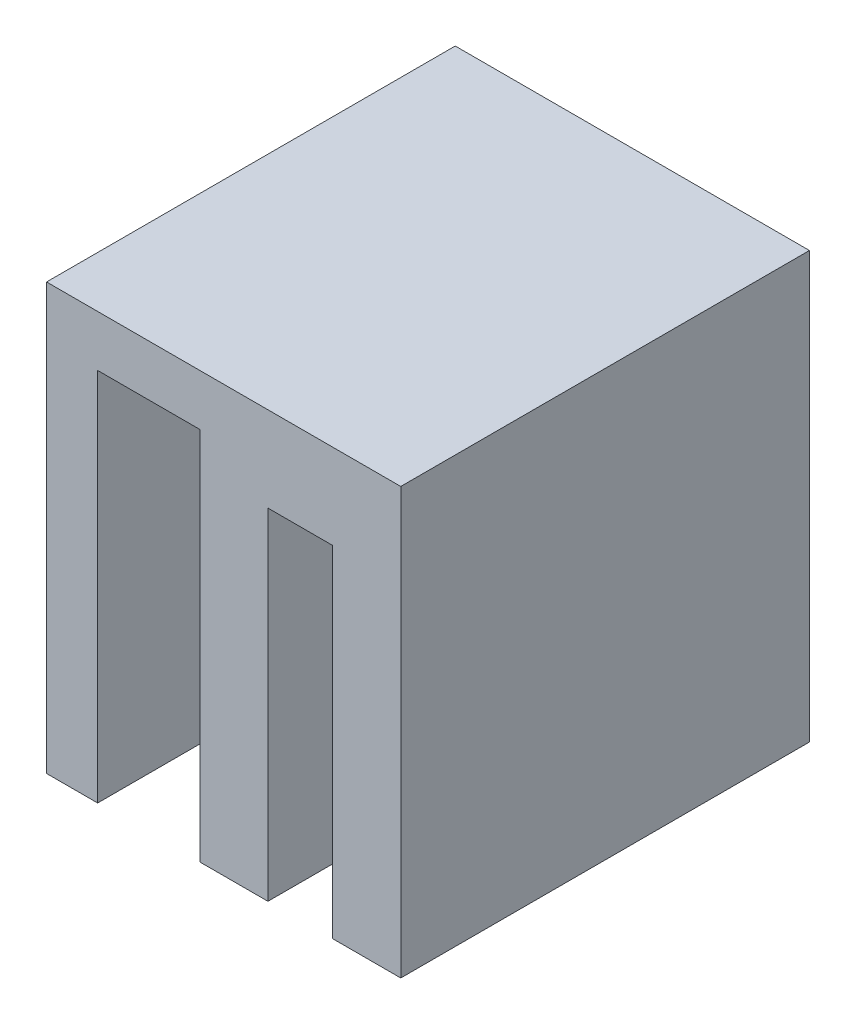
ISO-10303-21;
HEADER;
FILE_DESCRIPTION(('STEP AP214'),'2;1');
FILE_NAME('part.step','',(''),(''),'','','');
FILE_SCHEMA(('AUTOMOTIVE_DESIGN { 1 0 10303 214 1 1 1 1 }'));
ENDSEC;
DATA;
#1=APPLICATION_CONTEXT('core data for automotive mechanical design processes');
#2=APPLICATION_PROTOCOL_DEFINITION('international standard','automotive_design',2000,#1);
#3=PRODUCT_CONTEXT('',#1,'mechanical');
#4=PRODUCT('Part','Part','',(#3));
#5=PRODUCT_RELATED_PRODUCT_CATEGORY('part','',(#4));
#6=PRODUCT_DEFINITION_FORMATION('','',#4);
#7=PRODUCT_DEFINITION_CONTEXT('part definition',#1,'design');
#8=PRODUCT_DEFINITION('design','',#6,#7);
#9=PRODUCT_DEFINITION_SHAPE('','',#8);
#10=(LENGTH_UNIT() NAMED_UNIT(*) SI_UNIT(.MILLI.,.METRE.));
#11=(NAMED_UNIT(*) PLANE_ANGLE_UNIT() SI_UNIT($,.RADIAN.));
#12=(NAMED_UNIT(*) SI_UNIT($,.STERADIAN.) SOLID_ANGLE_UNIT());
#13=UNCERTAINTY_MEASURE_WITH_UNIT(LENGTH_MEASURE(1.E-05),#10,'distance_accuracy_value','');
#14=(GEOMETRIC_REPRESENTATION_CONTEXT(3) GLOBAL_UNCERTAINTY_ASSIGNED_CONTEXT((#13)) GLOBAL_UNIT_ASSIGNED_CONTEXT((#10,
#11,#12)) REPRESENTATION_CONTEXT('',''));
#15=CARTESIAN_POINT('',(0.,0.,0.));
#16=DIRECTION('',(0.,0.,1.));
#17=DIRECTION('',(1.,0.,0.));
#18=AXIS2_PLACEMENT_3D('',#15,#16,#17);
#19=CARTESIAN_POINT('',(-8.4,0.,12.));
#20=DIRECTION('',(1.,0.,0.));
#21=DIRECTION('',(0.,1.,0.));
#22=AXIS2_PLACEMENT_3D('',#19,#20,#21);
#23=PLANE('',#22);
#24=DIRECTION('',(0.,-1.,0.));
#25=VECTOR('',#24,1.);
#26=CARTESIAN_POINT('',(-8.4,0.,0.));
#27=LINE('',#26,#25);
#28=CARTESIAN_POINT('',(-8.4,2.5,0.));
#29=VERTEX_POINT('',#28);
#30=CARTESIAN_POINT('',(-8.4,-10.,0.));
#31=VERTEX_POINT('',#30);
#32=EDGE_CURVE('E153',#29,#31,#27,.T.);
#33=ORIENTED_EDGE('',*,*,#32,.T.);
#34=DIRECTION('',(0.,0.,-1.));
#35=VECTOR('',#34,1.);
#36=CARTESIAN_POINT('',(-8.4,-10.,12.));
#37=LINE('',#36,#35);
#38=CARTESIAN_POINT('',(-8.4,-10.,12.));
#39=VERTEX_POINT('',#38);
#40=EDGE_CURVE('E11',#39,#31,#37,.T.);
#41=ORIENTED_EDGE('',*,*,#40,.F.);
#42=DIRECTION('',(0.,-1.,0.));
#43=VECTOR('',#42,1.);
#44=CARTESIAN_POINT('',(-8.4,0.,12.));
#45=LINE('',#44,#43);
#46=CARTESIAN_POINT('',(-8.4,2.5,12.));
#47=VERTEX_POINT('',#46);
#48=EDGE_CURVE('E178',#47,#39,#45,.T.);
#49=ORIENTED_EDGE('',*,*,#48,.F.);
#50=DIRECTION('',(0.,0.,-1.));
#51=VECTOR('',#50,1.);
#52=CARTESIAN_POINT('',(-8.4,2.5,12.));
#53=LINE('',#52,#51);
#54=EDGE_CURVE('E149',#47,#29,#53,.T.);
#55=ORIENTED_EDGE('',*,*,#54,.T.);
#56=EDGE_LOOP('',(#33,#41,#49,#55));
#57=FACE_BOUND('',#56,.T.);
#58=ADVANCED_FACE('F33',(#57),#23,.F.);
#59=CARTESIAN_POINT('',(0.,-10.,12.));
#60=DIRECTION('',(0.,1.,0.));
#61=DIRECTION('',(0.,0.,1.));
#62=AXIS2_PLACEMENT_3D('',#59,#60,#61);
#63=PLANE('',#62);
#64=DIRECTION('',(1.,0.,0.));
#65=VECTOR('',#64,1.);
#66=CARTESIAN_POINT('',(0.,-10.,0.));
#67=LINE('',#66,#65);
#68=CARTESIAN_POINT('',(-6.9,-10.,0.));
#69=VERTEX_POINT('',#68);
#70=EDGE_CURVE('E156',#31,#69,#67,.T.);
#71=ORIENTED_EDGE('',*,*,#70,.T.);
#72=DIRECTION('',(0.,0.,-1.));
#73=VECTOR('',#72,1.);
#74=CARTESIAN_POINT('',(-6.9,-10.,12.));
#75=LINE('',#74,#73);
#76=CARTESIAN_POINT('',(-6.9,-10.,12.));
#77=VERTEX_POINT('',#76);
#78=EDGE_CURVE('E41',#77,#69,#75,.T.);
#79=ORIENTED_EDGE('',*,*,#78,.F.);
#80=DIRECTION('',(1.,0.,0.));
#81=VECTOR('',#80,1.);
#82=CARTESIAN_POINT('',(0.,-10.,12.));
#83=LINE('',#82,#81);
#84=EDGE_CURVE('E104',#39,#77,#83,.T.);
#85=ORIENTED_EDGE('',*,*,#84,.F.);
#86=ORIENTED_EDGE('',*,*,#40,.T.);
#87=EDGE_LOOP('',(#71,#79,#85,#86));
#88=FACE_BOUND('',#87,.T.);
#89=ADVANCED_FACE('F203',(#88),#63,.F.);
#90=CARTESIAN_POINT('',(-6.9,0.,12.));
#91=DIRECTION('',(1.,0.,0.));
#92=DIRECTION('',(0.,1.,0.));
#93=AXIS2_PLACEMENT_3D('',#90,#91,#92);
#94=PLANE('',#93);
#95=DIRECTION('',(0.,-1.,0.));
#96=VECTOR('',#95,1.);
#97=CARTESIAN_POINT('',(-6.9,0.,0.));
#98=LINE('',#97,#96);
#99=CARTESIAN_POINT('',(-6.9,0.999999999999999,0.));
#100=VERTEX_POINT('',#99);
#101=EDGE_CURVE('E159',#100,#69,#98,.T.);
#102=ORIENTED_EDGE('',*,*,#101,.F.);
#103=DIRECTION('',(0.,0.,-1.));
#104=VECTOR('',#103,1.);
#105=CARTESIAN_POINT('',(-6.9,0.999999999999999,12.));
#106=LINE('',#105,#104);
#107=CARTESIAN_POINT('',(-6.9,0.999999999999999,12.));
#108=VERTEX_POINT('',#107);
#109=EDGE_CURVE('E196',#108,#100,#106,.T.);
#110=ORIENTED_EDGE('',*,*,#109,.F.);
#111=DIRECTION('',(0.,-1.,0.));
#112=VECTOR('',#111,1.);
#113=CARTESIAN_POINT('',(-6.9,0.,12.));
#114=LINE('',#113,#112);
#115=EDGE_CURVE('E202',#108,#77,#114,.T.);
#116=ORIENTED_EDGE('',*,*,#115,.T.);
#117=ORIENTED_EDGE('',*,*,#78,.T.);
#118=EDGE_LOOP('',(#102,#110,#116,#117));
#119=FACE_BOUND('',#118,.T.);
#120=ADVANCED_FACE('F200',(#119),#94,.T.);
#121=CARTESIAN_POINT('',(0.,1.,12.));
#122=DIRECTION('',(0.,-1.,0.));
#123=DIRECTION('',(1.,0.,0.));
#124=AXIS2_PLACEMENT_3D('',#121,#122,#123);
#125=PLANE('',#124);
#126=DIRECTION('',(-1.,0.,0.));
#127=VECTOR('',#126,1.);
#128=CARTESIAN_POINT('',(0.,1.,0.));
#129=LINE('',#128,#127);
#130=CARTESIAN_POINT('',(-3.9,0.999999999999999,0.));
#131=VERTEX_POINT('',#130);
#132=EDGE_CURVE('E162',#131,#100,#129,.T.);
#133=ORIENTED_EDGE('',*,*,#132,.F.);
#134=DIRECTION('',(0.,0.,-1.));
#135=VECTOR('',#134,1.);
#136=CARTESIAN_POINT('',(-3.9,0.999999999999999,12.));
#137=LINE('',#136,#135);
#138=CARTESIAN_POINT('',(-3.9,0.999999999999999,12.));
#139=VERTEX_POINT('',#138);
#140=EDGE_CURVE('E194',#139,#131,#137,.T.);
#141=ORIENTED_EDGE('',*,*,#140,.F.);
#142=DIRECTION('',(-1.,0.,0.));
#143=VECTOR('',#142,1.);
#144=CARTESIAN_POINT('',(0.,1.,12.));
#145=LINE('',#144,#143);
#146=EDGE_CURVE('E216',#139,#108,#145,.T.);
#147=ORIENTED_EDGE('',*,*,#146,.T.);
#148=ORIENTED_EDGE('',*,*,#109,.T.);
#149=EDGE_LOOP('',(#133,#141,#147,#148));
#150=FACE_BOUND('',#149,.T.);
#151=ADVANCED_FACE('F212',(#150),#125,.T.);
#152=CARTESIAN_POINT('',(-3.9,0.,12.));
#153=DIRECTION('',(1.,0.,0.));
#154=DIRECTION('',(0.,1.,0.));
#155=AXIS2_PLACEMENT_3D('',#152,#153,#154);
#156=PLANE('',#155);
#157=DIRECTION('',(0.,-1.,0.));
#158=VECTOR('',#157,1.);
#159=CARTESIAN_POINT('',(-3.9,0.,0.));
#160=LINE('',#159,#158);
#161=CARTESIAN_POINT('',(-3.9,-10.,0.));
#162=VERTEX_POINT('',#161);
#163=EDGE_CURVE('E165',#131,#162,#160,.T.);
#164=ORIENTED_EDGE('',*,*,#163,.T.);
#165=DIRECTION('',(0.,0.,-1.));
#166=VECTOR('',#165,1.);
#167=CARTESIAN_POINT('',(-3.9,-10.,12.));
#168=LINE('',#167,#166);
#169=CARTESIAN_POINT('',(-3.9,-10.,12.));
#170=VERTEX_POINT('',#169);
#171=EDGE_CURVE('E191',#170,#162,#168,.T.);
#172=ORIENTED_EDGE('',*,*,#171,.F.);
#173=DIRECTION('',(0.,-1.,0.));
#174=VECTOR('',#173,1.);
#175=CARTESIAN_POINT('',(-3.9,0.,12.));
#176=LINE('',#175,#174);
#177=EDGE_CURVE('E218',#139,#170,#176,.T.);
#178=ORIENTED_EDGE('',*,*,#177,.F.);
#179=ORIENTED_EDGE('',*,*,#140,.T.);
#180=EDGE_LOOP('',(#164,#172,#178,#179));
#181=FACE_BOUND('',#180,.T.);
#182=ADVANCED_FACE('F262',(#181),#156,.F.);
#183=CARTESIAN_POINT('',(0.,-10.,12.));
#184=DIRECTION('',(0.,1.,0.));
#185=DIRECTION('',(0.,0.,1.));
#186=AXIS2_PLACEMENT_3D('',#183,#184,#185);
#187=PLANE('',#186);
#188=DIRECTION('',(1.,0.,0.));
#189=VECTOR('',#188,1.);
#190=CARTESIAN_POINT('',(0.,-10.,0.));
#191=LINE('',#190,#189);
#192=CARTESIAN_POINT('',(-1.9,-10.,0.));
#193=VERTEX_POINT('',#192);
#194=EDGE_CURVE('E167',#162,#193,#191,.T.);
#195=ORIENTED_EDGE('',*,*,#194,.T.);
#196=DIRECTION('',(0.,0.,-1.));
#197=VECTOR('',#196,1.);
#198=CARTESIAN_POINT('',(-1.9,-10.,12.));
#199=LINE('',#198,#197);
#200=CARTESIAN_POINT('',(-1.9,-10.,12.));
#201=VERTEX_POINT('',#200);
#202=EDGE_CURVE('E188',#201,#193,#199,.T.);
#203=ORIENTED_EDGE('',*,*,#202,.F.);
#204=DIRECTION('',(1.,0.,0.));
#205=VECTOR('',#204,1.);
#206=CARTESIAN_POINT('',(0.,-10.,12.));
#207=LINE('',#206,#205);
#208=EDGE_CURVE('E224',#170,#201,#207,.T.);
#209=ORIENTED_EDGE('',*,*,#208,.F.);
#210=ORIENTED_EDGE('',*,*,#171,.T.);
#211=EDGE_LOOP('',(#195,#203,#209,#210));
#212=FACE_BOUND('',#211,.T.);
#213=ADVANCED_FACE('F265',(#212),#187,.F.);
#214=CARTESIAN_POINT('',(-1.9,0.,12.));
#215=DIRECTION('',(-1.,0.,0.));
#216=DIRECTION('',(0.,-1.,0.));
#217=AXIS2_PLACEMENT_3D('',#214,#215,#216);
#218=PLANE('',#217);
#219=DIRECTION('',(0.,1.,0.));
#220=VECTOR('',#219,1.);
#221=CARTESIAN_POINT('',(-1.9,0.,0.));
#222=LINE('',#221,#220);
#223=CARTESIAN_POINT('',(-1.9,0.,0.));
#224=VERTEX_POINT('',#223);
#225=EDGE_CURVE('E169',#193,#224,#222,.T.);
#226=ORIENTED_EDGE('',*,*,#225,.T.);
#227=DIRECTION('',(0.,0.,-1.));
#228=VECTOR('',#227,1.);
#229=CARTESIAN_POINT('',(-1.9,0.,12.));
#230=LINE('',#229,#228);
#231=CARTESIAN_POINT('',(-1.9,0.,12.));
#232=VERTEX_POINT('',#231);
#233=EDGE_CURVE('E185',#232,#224,#230,.T.);
#234=ORIENTED_EDGE('',*,*,#233,.F.);
#235=DIRECTION('',(0.,1.,0.));
#236=VECTOR('',#235,1.);
#237=CARTESIAN_POINT('',(-1.9,0.,12.));
#238=LINE('',#237,#236);
#239=EDGE_CURVE('E226',#201,#232,#238,.T.);
#240=ORIENTED_EDGE('',*,*,#239,.F.);
#241=ORIENTED_EDGE('',*,*,#202,.T.);
#242=EDGE_LOOP('',(#226,#234,#240,#241));
#243=FACE_BOUND('',#242,.T.);
#244=ADVANCED_FACE('F269',(#243),#218,.F.);
#245=CARTESIAN_POINT('',(0.,0.,12.));
#246=DIRECTION('',(0.,1.,0.));
#247=DIRECTION('',(-1.,0.,0.));
#248=AXIS2_PLACEMENT_3D('',#245,#246,#247);
#249=PLANE('',#248);
#250=DIRECTION('',(1.,0.,0.));
#251=VECTOR('',#250,1.);
#252=CARTESIAN_POINT('',(0.,0.,0.));
#253=LINE('',#252,#251);
#254=CARTESIAN_POINT('',(0.,0.,0.));
#255=VERTEX_POINT('',#254);
#256=EDGE_CURVE('E171',#224,#255,#253,.T.);
#257=ORIENTED_EDGE('',*,*,#256,.T.);
#258=DIRECTION('',(0.,0.,-1.));
#259=VECTOR('',#258,1.);
#260=CARTESIAN_POINT('',(0.,0.,12.));
#261=LINE('',#260,#259);
#262=CARTESIAN_POINT('',(0.,0.,12.));
#263=VERTEX_POINT('',#262);
#264=EDGE_CURVE('E182',#263,#255,#261,.T.);
#265=ORIENTED_EDGE('',*,*,#264,.F.);
#266=DIRECTION('',(1.,0.,0.));
#267=VECTOR('',#266,1.);
#268=CARTESIAN_POINT('',(0.,0.,12.));
#269=LINE('',#268,#267);
#270=EDGE_CURVE('E228',#232,#263,#269,.T.);
#271=ORIENTED_EDGE('',*,*,#270,.F.);
#272=ORIENTED_EDGE('',*,*,#233,.T.);
#273=EDGE_LOOP('',(#257,#265,#271,#272));
#274=FACE_BOUND('',#273,.T.);
#275=ADVANCED_FACE('F234',(#274),#249,.F.);
#276=CARTESIAN_POINT('',(0.,0.,12.));
#277=DIRECTION('',(1.,0.,0.));
#278=DIRECTION('',(0.,1.,0.));
#279=AXIS2_PLACEMENT_3D('',#276,#277,#278);
#280=PLANE('',#279);
#281=DIRECTION('',(0.,-1.,0.));
#282=VECTOR('',#281,1.);
#283=CARTESIAN_POINT('',(0.,0.,0.));
#284=LINE('',#283,#282);
#285=CARTESIAN_POINT('',(0.,-10.,0.));
#286=VERTEX_POINT('',#285);
#287=EDGE_CURVE('E173',#255,#286,#284,.T.);
#288=ORIENTED_EDGE('',*,*,#287,.T.);
#289=DIRECTION('',(0.,0.,-1.));
#290=VECTOR('',#289,1.);
#291=CARTESIAN_POINT('',(0.,-10.,12.));
#292=LINE('',#291,#290);
#293=CARTESIAN_POINT('',(0.,-10.,12.));
#294=VERTEX_POINT('',#293);
#295=EDGE_CURVE('E144',#294,#286,#292,.T.);
#296=ORIENTED_EDGE('',*,*,#295,.F.);
#297=DIRECTION('',(0.,-1.,0.));
#298=VECTOR('',#297,1.);
#299=CARTESIAN_POINT('',(0.,0.,12.));
#300=LINE('',#299,#298);
#301=EDGE_CURVE('E135',#263,#294,#300,.T.);
#302=ORIENTED_EDGE('',*,*,#301,.F.);
#303=ORIENTED_EDGE('',*,*,#264,.T.);
#304=EDGE_LOOP('',(#288,#296,#302,#303));
#305=FACE_BOUND('',#304,.T.);
#306=ADVANCED_FACE('F238',(#305),#280,.F.);
#307=CARTESIAN_POINT('',(0.,-10.,12.));
#308=DIRECTION('',(0.,1.,0.));
#309=DIRECTION('',(0.,0.,1.));
#310=AXIS2_PLACEMENT_3D('',#307,#308,#309);
#311=PLANE('',#310);
#312=DIRECTION('',(1.,0.,0.));
#313=VECTOR('',#312,1.);
#314=CARTESIAN_POINT('',(0.,-10.,0.));
#315=LINE('',#314,#313);
#316=CARTESIAN_POINT('',(2.,-10.,0.));
#317=VERTEX_POINT('',#316);
#318=EDGE_CURVE('E143',#286,#317,#315,.T.);
#319=ORIENTED_EDGE('',*,*,#318,.T.);
#320=DIRECTION('',(0.,0.,-1.));
#321=VECTOR('',#320,1.);
#322=CARTESIAN_POINT('',(2.,-10.,12.));
#323=LINE('',#322,#321);
#324=CARTESIAN_POINT('',(2.,-10.,12.));
#325=VERTEX_POINT('',#324);
#326=EDGE_CURVE('E140',#325,#317,#323,.T.);
#327=ORIENTED_EDGE('',*,*,#326,.F.);
#328=DIRECTION('',(1.,0.,0.));
#329=VECTOR('',#328,1.);
#330=CARTESIAN_POINT('',(0.,-10.,12.));
#331=LINE('',#330,#329);
#332=EDGE_CURVE('E129',#294,#325,#331,.T.);
#333=ORIENTED_EDGE('',*,*,#332,.F.);
#334=ORIENTED_EDGE('',*,*,#295,.T.);
#335=EDGE_LOOP('',(#319,#327,#333,#334));
#336=FACE_BOUND('',#335,.T.);
#337=ADVANCED_FACE('F141',(#336),#311,.F.);
#338=CARTESIAN_POINT('',(2.,0.,12.));
#339=DIRECTION('',(-1.,0.,0.));
#340=DIRECTION('',(0.,-1.,0.));
#341=AXIS2_PLACEMENT_3D('',#338,#339,#340);
#342=PLANE('',#341);
#343=DIRECTION('',(0.,1.,0.));
#344=VECTOR('',#343,1.);
#345=CARTESIAN_POINT('',(2.,0.,0.));
#346=LINE('',#345,#344);
#347=CARTESIAN_POINT('',(2.,2.5,0.));
#348=VERTEX_POINT('',#347);
#349=EDGE_CURVE('E90',#317,#348,#346,.T.);
#350=ORIENTED_EDGE('',*,*,#349,.T.);
#351=DIRECTION('',(0.,0.,-1.));
#352=VECTOR('',#351,1.);
#353=CARTESIAN_POINT('',(2.,2.5,12.));
#354=LINE('',#353,#352);
#355=CARTESIAN_POINT('',(2.,2.5,12.));
#356=VERTEX_POINT('',#355);
#357=EDGE_CURVE('E145',#356,#348,#354,.T.);
#358=ORIENTED_EDGE('',*,*,#357,.F.);
#359=DIRECTION('',(0.,1.,0.));
#360=VECTOR('',#359,1.);
#361=CARTESIAN_POINT('',(2.,0.,12.));
#362=LINE('',#361,#360);
#363=EDGE_CURVE('E133',#325,#356,#362,.T.);
#364=ORIENTED_EDGE('',*,*,#363,.F.);
#365=ORIENTED_EDGE('',*,*,#326,.T.);
#366=EDGE_LOOP('',(#350,#358,#364,#365));
#367=FACE_BOUND('',#366,.T.);
#368=ADVANCED_FACE('F147',(#367),#342,.F.);
#369=CARTESIAN_POINT('',(0.,2.5,12.));
#370=DIRECTION('',(0.,-1.,0.));
#371=DIRECTION('',(1.,0.,0.));
#372=AXIS2_PLACEMENT_3D('',#369,#370,#371);
#373=PLANE('',#372);
#374=DIRECTION('',(-1.,0.,0.));
#375=VECTOR('',#374,1.);
#376=CARTESIAN_POINT('',(0.,2.5,0.));
#377=LINE('',#376,#375);
#378=EDGE_CURVE('E96',#348,#29,#377,.T.);
#379=ORIENTED_EDGE('',*,*,#378,.T.);
#380=ORIENTED_EDGE('',*,*,#54,.F.);
#381=DIRECTION('',(-1.,0.,0.));
#382=VECTOR('',#381,1.);
#383=CARTESIAN_POINT('',(0.,2.5,12.));
#384=LINE('',#383,#382);
#385=EDGE_CURVE('E49',#356,#47,#384,.T.);
#386=ORIENTED_EDGE('',*,*,#385,.F.);
#387=ORIENTED_EDGE('',*,*,#357,.T.);
#388=EDGE_LOOP('',(#379,#380,#386,#387));
#389=FACE_BOUND('',#388,.T.);
#390=ADVANCED_FACE('F241',(#389),#373,.F.);
#391=CARTESIAN_POINT('',(0.,0.,12.));
#392=DIRECTION('',(0.,0.,1.));
#393=DIRECTION('',(1.,0.,0.));
#394=AXIS2_PLACEMENT_3D('',#391,#392,#393);
#395=PLANE('',#394);
#396=ORIENTED_EDGE('',*,*,#48,.T.);
#397=ORIENTED_EDGE('',*,*,#84,.T.);
#398=ORIENTED_EDGE('',*,*,#115,.F.);
#399=ORIENTED_EDGE('',*,*,#146,.F.);
#400=ORIENTED_EDGE('',*,*,#177,.T.);
#401=ORIENTED_EDGE('',*,*,#208,.T.);
#402=ORIENTED_EDGE('',*,*,#239,.T.);
#403=ORIENTED_EDGE('',*,*,#270,.T.);
#404=ORIENTED_EDGE('',*,*,#301,.T.);
#405=ORIENTED_EDGE('',*,*,#332,.T.);
#406=ORIENTED_EDGE('',*,*,#363,.T.);
#407=ORIENTED_EDGE('',*,*,#385,.T.);
#408=EDGE_LOOP('',(#396,#397,#398,#399,#400,#401,#402,#403,#404,#405,#406,#407));
#409=FACE_BOUND('',#408,.T.);
#410=ADVANCED_FACE('F131',(#409),#395,.T.);
#411=CARTESIAN_POINT('',(0.,0.,0.));
#412=DIRECTION('',(0.,0.,1.));
#413=DIRECTION('',(1.,0.,0.));
#414=AXIS2_PLACEMENT_3D('',#411,#412,#413);
#415=PLANE('',#414);
#416=ORIENTED_EDGE('',*,*,#32,.F.);
#417=ORIENTED_EDGE('',*,*,#378,.F.);
#418=ORIENTED_EDGE('',*,*,#349,.F.);
#419=ORIENTED_EDGE('',*,*,#318,.F.);
#420=ORIENTED_EDGE('',*,*,#287,.F.);
#421=ORIENTED_EDGE('',*,*,#256,.F.);
#422=ORIENTED_EDGE('',*,*,#225,.F.);
#423=ORIENTED_EDGE('',*,*,#194,.F.);
#424=ORIENTED_EDGE('',*,*,#163,.F.);
#425=ORIENTED_EDGE('',*,*,#132,.T.);
#426=ORIENTED_EDGE('',*,*,#101,.T.);
#427=ORIENTED_EDGE('',*,*,#70,.F.);
#428=EDGE_LOOP('',(#416,#417,#418,#419,#420,#421,#422,#423,#424,#425,#426,#427));
#429=FACE_BOUND('',#428,.T.);
#430=ADVANCED_FACE('F207',(#429),#415,.F.);
#431=CLOSED_SHELL('',(#58,#89,#120,#151,#182,#213,#244,#275,#306,#337,#368,#390,#410,#430));
#432=MANIFOLD_SOLID_BREP('B2',#431);
#433=ADVANCED_BREP_SHAPE_REPRESENTATION('',(#18,#432),#14);
#434=SHAPE_DEFINITION_REPRESENTATION(#9,#433);
ENDSEC;
END-ISO-10303-21;
